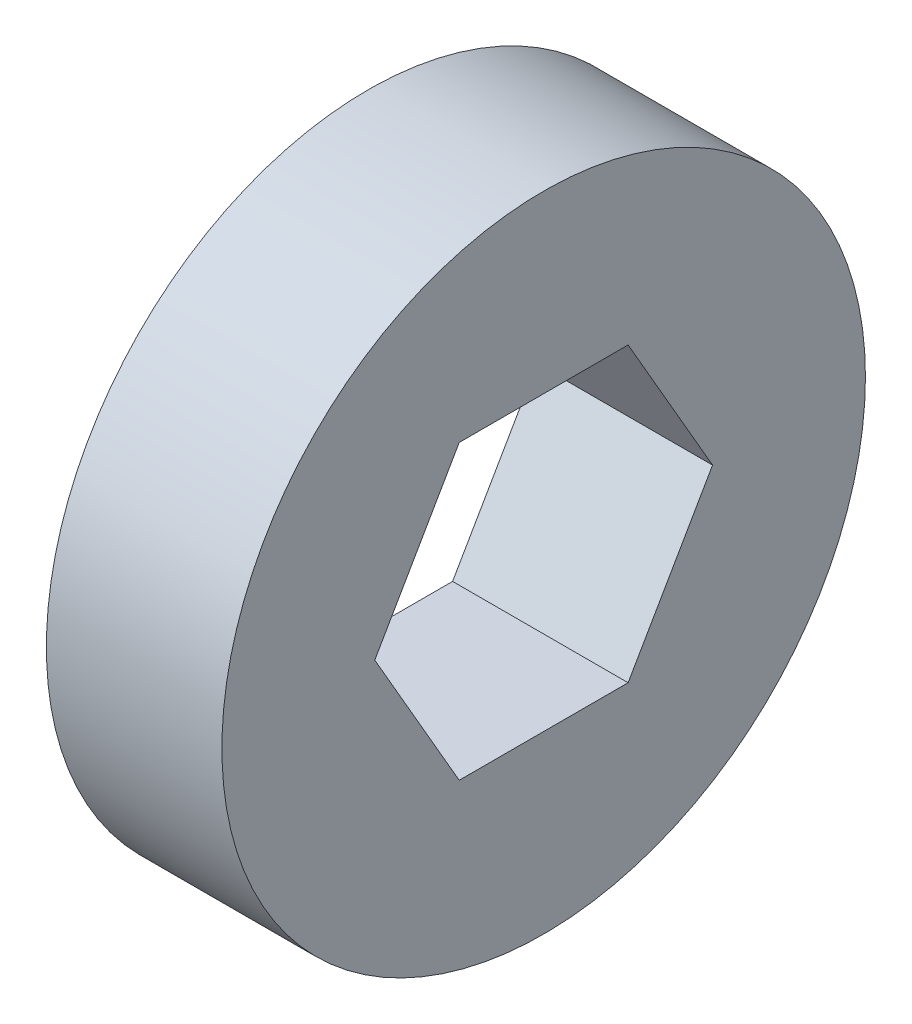
ISO-10303-21;
HEADER;
FILE_DESCRIPTION(('STEP AP214'),'2;1');
FILE_NAME('part.step','',(''),(''),'','','');
FILE_SCHEMA(('AUTOMOTIVE_DESIGN { 1 0 10303 214 1 1 1 1 }'));
ENDSEC;
DATA;
#1=APPLICATION_CONTEXT('core data for automotive mechanical design processes');
#2=APPLICATION_PROTOCOL_DEFINITION('international standard','automotive_design',2000,#1);
#3=PRODUCT_CONTEXT('',#1,'mechanical');
#4=PRODUCT('Part','Part','',(#3));
#5=PRODUCT_RELATED_PRODUCT_CATEGORY('part','',(#4));
#6=PRODUCT_DEFINITION_FORMATION('','',#4);
#7=PRODUCT_DEFINITION_CONTEXT('part definition',#1,'design');
#8=PRODUCT_DEFINITION('design','',#6,#7);
#9=PRODUCT_DEFINITION_SHAPE('','',#8);
#10=(LENGTH_UNIT() NAMED_UNIT(*) SI_UNIT(.MILLI.,.METRE.));
#11=(NAMED_UNIT(*) PLANE_ANGLE_UNIT() SI_UNIT($,.RADIAN.));
#12=(NAMED_UNIT(*) SI_UNIT($,.STERADIAN.) SOLID_ANGLE_UNIT());
#13=UNCERTAINTY_MEASURE_WITH_UNIT(LENGTH_MEASURE(1.E-05),#10,'distance_accuracy_value','');
#14=(GEOMETRIC_REPRESENTATION_CONTEXT(3) GLOBAL_UNCERTAINTY_ASSIGNED_CONTEXT((#13)) GLOBAL_UNIT_ASSIGNED_CONTEXT((#10,
#11,#12)) REPRESENTATION_CONTEXT('',''));
#15=CARTESIAN_POINT('',(0.,0.,0.));
#16=DIRECTION('',(0.,0.,1.));
#17=DIRECTION('',(1.,0.,0.));
#18=AXIS2_PLACEMENT_3D('',#15,#16,#17);
#19=CARTESIAN_POINT('',(3.,0.,0.));
#20=DIRECTION('',(1.,0.,0.));
#21=DIRECTION('',(0.,0.,-1.));
#22=AXIS2_PLACEMENT_3D('',#19,#20,#21);
#23=PLANE('',#22);
#24=CARTESIAN_POINT('',(3.,0.,0.));
#25=DIRECTION('',(1.,0.,0.));
#26=DIRECTION('',(0.,0.,-1.));
#27=AXIS2_PLACEMENT_3D('',#24,#25,#26);
#28=CIRCLE('',#27,5.5);
#29=CARTESIAN_POINT('',(3.,0.,-5.5));
#30=VERTEX_POINT('',#29);
#31=EDGE_CURVE('E11',#30,#30,#28,.T.);
#32=ORIENTED_EDGE('',*,*,#31,.T.);
#33=EDGE_LOOP('',(#32));
#34=FACE_BOUND('',#33,.T.);
#35=DIRECTION('',(0.,0.866025403784438,0.500000000000001));
#36=VECTOR('',#35,1.);
#37=CARTESIAN_POINT('',(3.,0.,-2.88675134594811));
#38=LINE('',#37,#36);
#39=CARTESIAN_POINT('',(3.,0.,-2.88675134594811));
#40=VERTEX_POINT('',#39);
#41=CARTESIAN_POINT('',(3.,2.49999999999999,-1.44337567297405));
#42=VERTEX_POINT('',#41);
#43=EDGE_CURVE('E104',#40,#42,#38,.T.);
#44=ORIENTED_EDGE('',*,*,#43,.F.);
#45=DIRECTION('',(0.,0.866025403784441,-0.499999999999995));
#46=VECTOR('',#45,1.);
#47=CARTESIAN_POINT('',(3.,-2.49999999999997,-1.44337567297409));
#48=LINE('',#47,#46);
#49=CARTESIAN_POINT('',(3.,-2.49999999999997,-1.44337567297409));
#50=VERTEX_POINT('',#49);
#51=EDGE_CURVE('E96',#50,#40,#48,.T.);
#52=ORIENTED_EDGE('',*,*,#51,.F.);
#53=DIRECTION('',(0.,0.,-1.));
#54=VECTOR('',#53,1.);
#55=CARTESIAN_POINT('',(3.,-2.5,1.44337567297403));
#56=LINE('',#55,#54);
#57=CARTESIAN_POINT('',(3.,-2.5,1.44337567297403));
#58=VERTEX_POINT('',#57);
#59=EDGE_CURVE('E124',#58,#50,#56,.T.);
#60=ORIENTED_EDGE('',*,*,#59,.F.);
#61=DIRECTION('',(0.,-0.866025403784435,-0.500000000000007));
#62=VECTOR('',#61,1.);
#63=CARTESIAN_POINT('',(3.,0.,2.88675134594811));
#64=LINE('',#63,#62);
#65=CARTESIAN_POINT('',(3.,0.,2.88675134594811));
#66=VERTEX_POINT('',#65);
#67=EDGE_CURVE('E122',#66,#58,#64,.T.);
#68=ORIENTED_EDGE('',*,*,#67,.F.);
#69=DIRECTION('',(0.,-0.866025403784441,0.499999999999995));
#70=VECTOR('',#69,1.);
#71=CARTESIAN_POINT('',(3.,2.49999999999998,1.44337567297407));
#72=LINE('',#71,#70);
#73=CARTESIAN_POINT('',(3.,2.49999999999998,1.44337567297407));
#74=VERTEX_POINT('',#73);
#75=EDGE_CURVE('E118',#74,#66,#72,.T.);
#76=ORIENTED_EDGE('',*,*,#75,.F.);
#77=DIRECTION('',(0.,0.,1.));
#78=VECTOR('',#77,1.);
#79=CARTESIAN_POINT('',(3.,2.49999999999999,-1.44337567297405));
#80=LINE('',#79,#78);
#81=EDGE_CURVE('E116',#42,#74,#80,.T.);
#82=ORIENTED_EDGE('',*,*,#81,.F.);
#83=EDGE_LOOP('',(#44,#52,#60,#68,#76,#82));
#84=FACE_BOUND('',#83,.T.);
#85=ADVANCED_FACE('F43',(#34,#84),#23,.T.);
#86=CARTESIAN_POINT('',(0.,0.,0.));
#87=DIRECTION('',(1.,0.,0.));
#88=DIRECTION('',(0.,0.,-1.));
#89=AXIS2_PLACEMENT_3D('',#86,#87,#88);
#90=PLANE('',#89);
#91=CARTESIAN_POINT('',(0.,0.,0.));
#92=DIRECTION('',(1.,0.,0.));
#93=DIRECTION('',(0.,0.,-1.));
#94=AXIS2_PLACEMENT_3D('',#91,#92,#93);
#95=CIRCLE('',#94,5.5);
#96=CARTESIAN_POINT('',(0.,0.,-5.5));
#97=VERTEX_POINT('',#96);
#98=EDGE_CURVE('E47',#97,#97,#95,.T.);
#99=ORIENTED_EDGE('',*,*,#98,.F.);
#100=EDGE_LOOP('',(#99));
#101=FACE_BOUND('',#100,.T.);
#102=DIRECTION('',(0.,0.866025403784441,-0.499999999999995));
#103=VECTOR('',#102,1.);
#104=CARTESIAN_POINT('',(0.,-2.49999999999997,-1.44337567297409));
#105=LINE('',#104,#103);
#106=CARTESIAN_POINT('',(0.,-2.49999999999997,-1.44337567297409));
#107=VERTEX_POINT('',#106);
#108=CARTESIAN_POINT('',(0.,0.,-2.88675134594811));
#109=VERTEX_POINT('',#108);
#110=EDGE_CURVE('E66',#107,#109,#105,.T.);
#111=ORIENTED_EDGE('',*,*,#110,.T.);
#112=DIRECTION('',(0.,0.866025403784438,0.500000000000001));
#113=VECTOR('',#112,1.);
#114=CARTESIAN_POINT('',(0.,0.,-2.88675134594811));
#115=LINE('',#114,#113);
#116=CARTESIAN_POINT('',(0.,2.49999999999999,-1.44337567297405));
#117=VERTEX_POINT('',#116);
#118=EDGE_CURVE('E111',#109,#117,#115,.T.);
#119=ORIENTED_EDGE('',*,*,#118,.T.);
#120=DIRECTION('',(0.,0.,1.));
#121=VECTOR('',#120,1.);
#122=CARTESIAN_POINT('',(0.,2.49999999999999,-1.44337567297405));
#123=LINE('',#122,#121);
#124=CARTESIAN_POINT('',(0.,2.49999999999998,1.44337567297407));
#125=VERTEX_POINT('',#124);
#126=EDGE_CURVE('E128',#117,#125,#123,.T.);
#127=ORIENTED_EDGE('',*,*,#126,.T.);
#128=DIRECTION('',(0.,-0.866025403784441,0.499999999999995));
#129=VECTOR('',#128,1.);
#130=CARTESIAN_POINT('',(0.,2.49999999999998,1.44337567297407));
#131=LINE('',#130,#129);
#132=CARTESIAN_POINT('',(0.,0.,2.88675134594811));
#133=VERTEX_POINT('',#132);
#134=EDGE_CURVE('E131',#125,#133,#131,.T.);
#135=ORIENTED_EDGE('',*,*,#134,.T.);
#136=DIRECTION('',(0.,-0.866025403784435,-0.500000000000007));
#137=VECTOR('',#136,1.);
#138=CARTESIAN_POINT('',(0.,0.,2.88675134594811));
#139=LINE('',#138,#137);
#140=CARTESIAN_POINT('',(0.,-2.5,1.44337567297403));
#141=VERTEX_POINT('',#140);
#142=EDGE_CURVE('E134',#133,#141,#139,.T.);
#143=ORIENTED_EDGE('',*,*,#142,.T.);
#144=DIRECTION('',(0.,0.,-1.));
#145=VECTOR('',#144,1.);
#146=CARTESIAN_POINT('',(0.,-2.5,1.44337567297403));
#147=LINE('',#146,#145);
#148=EDGE_CURVE('E105',#141,#107,#147,.T.);
#149=ORIENTED_EDGE('',*,*,#148,.T.);
#150=EDGE_LOOP('',(#111,#119,#127,#135,#143,#149));
#151=FACE_BOUND('',#150,.T.);
#152=ADVANCED_FACE('F151',(#101,#151),#90,.F.);
#153=CARTESIAN_POINT('',(3.,0.,0.));
#154=DIRECTION('',(-1.,0.,0.));
#155=DIRECTION('',(0.,0.,1.));
#156=AXIS2_PLACEMENT_3D('',#153,#154,#155);
#157=CYLINDRICAL_SURFACE('',#156,5.5);
#158=ORIENTED_EDGE('',*,*,#31,.F.);
#159=EDGE_LOOP('',(#158));
#160=FACE_BOUND('',#159,.T.);
#161=ORIENTED_EDGE('',*,*,#98,.T.);
#162=EDGE_LOOP('',(#161));
#163=FACE_BOUND('',#162,.T.);
#164=ADVANCED_FACE('F45',(#160,#163),#157,.T.);
#165=CARTESIAN_POINT('',(3.,-2.49999999999997,-1.44337567297409));
#166=DIRECTION('',(0.,0.499999999999995,0.866025403784442));
#167=DIRECTION('',(0.,-0.866025403784442,0.499999999999995));
#168=AXIS2_PLACEMENT_3D('',#165,#166,#167);
#169=PLANE('',#168);
#170=ORIENTED_EDGE('',*,*,#110,.F.);
#171=DIRECTION('',(-1.,0.,0.));
#172=VECTOR('',#171,1.);
#173=CARTESIAN_POINT('',(3.,-2.49999999999997,-1.44337567297409));
#174=LINE('',#173,#172);
#175=EDGE_CURVE('E100',#50,#107,#174,.T.);
#176=ORIENTED_EDGE('',*,*,#175,.F.);
#177=ORIENTED_EDGE('',*,*,#51,.T.);
#178=DIRECTION('',(-1.,0.,0.));
#179=VECTOR('',#178,1.);
#180=CARTESIAN_POINT('',(3.,0.,-2.88675134594811));
#181=LINE('',#180,#179);
#182=EDGE_CURVE('E99',#40,#109,#181,.T.);
#183=ORIENTED_EDGE('',*,*,#182,.T.);
#184=EDGE_LOOP('',(#170,#176,#177,#183));
#185=FACE_BOUND('',#184,.T.);
#186=ADVANCED_FACE('F98',(#185),#169,.T.);
#187=CARTESIAN_POINT('',(3.,0.,-2.88675134594811));
#188=DIRECTION('',(0.,-0.500000000000001,0.866025403784438));
#189=DIRECTION('',(0.,-0.866025403784438,-0.500000000000001));
#190=AXIS2_PLACEMENT_3D('',#187,#188,#189);
#191=PLANE('',#190);
#192=ORIENTED_EDGE('',*,*,#118,.F.);
#193=ORIENTED_EDGE('',*,*,#182,.F.);
#194=ORIENTED_EDGE('',*,*,#43,.T.);
#195=DIRECTION('',(-1.,0.,0.));
#196=VECTOR('',#195,1.);
#197=CARTESIAN_POINT('',(3.,2.49999999999999,-1.44337567297405));
#198=LINE('',#197,#196);
#199=EDGE_CURVE('E112',#42,#117,#198,.T.);
#200=ORIENTED_EDGE('',*,*,#199,.T.);
#201=EDGE_LOOP('',(#192,#193,#194,#200));
#202=FACE_BOUND('',#201,.T.);
#203=ADVANCED_FACE('F108',(#202),#191,.T.);
#204=CARTESIAN_POINT('',(3.,2.49999999999999,-1.44337567297405));
#205=DIRECTION('',(0.,-1.,0.));
#206=DIRECTION('',(0.,0.,-1.));
#207=AXIS2_PLACEMENT_3D('',#204,#205,#206);
#208=PLANE('',#207);
#209=ORIENTED_EDGE('',*,*,#126,.F.);
#210=ORIENTED_EDGE('',*,*,#199,.F.);
#211=ORIENTED_EDGE('',*,*,#81,.T.);
#212=DIRECTION('',(-1.,0.,0.));
#213=VECTOR('',#212,1.);
#214=CARTESIAN_POINT('',(3.,2.49999999999998,1.44337567297407));
#215=LINE('',#214,#213);
#216=EDGE_CURVE('E143',#74,#125,#215,.T.);
#217=ORIENTED_EDGE('',*,*,#216,.T.);
#218=EDGE_LOOP('',(#209,#210,#211,#217));
#219=FACE_BOUND('',#218,.T.);
#220=ADVANCED_FACE('F147',(#219),#208,.T.);
#221=CARTESIAN_POINT('',(3.,2.49999999999998,1.44337567297407));
#222=DIRECTION('',(0.,-0.499999999999995,-0.866025403784441));
#223=DIRECTION('',(0.,0.866025403784441,-0.499999999999995));
#224=AXIS2_PLACEMENT_3D('',#221,#222,#223);
#225=PLANE('',#224);
#226=ORIENTED_EDGE('',*,*,#134,.F.);
#227=ORIENTED_EDGE('',*,*,#216,.F.);
#228=ORIENTED_EDGE('',*,*,#75,.T.);
#229=DIRECTION('',(-1.,0.,0.));
#230=VECTOR('',#229,1.);
#231=CARTESIAN_POINT('',(3.,0.,2.88675134594811));
#232=LINE('',#231,#230);
#233=EDGE_CURVE('E141',#66,#133,#232,.T.);
#234=ORIENTED_EDGE('',*,*,#233,.T.);
#235=EDGE_LOOP('',(#226,#227,#228,#234));
#236=FACE_BOUND('',#235,.T.);
#237=ADVANCED_FACE('F159',(#236),#225,.T.);
#238=CARTESIAN_POINT('',(3.,0.,2.88675134594811));
#239=DIRECTION('',(0.,0.500000000000007,-0.866025403784434));
#240=DIRECTION('',(0.,0.866025403784435,0.500000000000007));
#241=AXIS2_PLACEMENT_3D('',#238,#239,#240);
#242=PLANE('',#241);
#243=ORIENTED_EDGE('',*,*,#142,.F.);
#244=ORIENTED_EDGE('',*,*,#233,.F.);
#245=ORIENTED_EDGE('',*,*,#67,.T.);
#246=DIRECTION('',(-1.,0.,0.));
#247=VECTOR('',#246,1.);
#248=CARTESIAN_POINT('',(3.,-2.5,1.44337567297403));
#249=LINE('',#248,#247);
#250=EDGE_CURVE('E58',#58,#141,#249,.T.);
#251=ORIENTED_EDGE('',*,*,#250,.T.);
#252=EDGE_LOOP('',(#243,#244,#245,#251));
#253=FACE_BOUND('',#252,.T.);
#254=ADVANCED_FACE('F157',(#253),#242,.T.);
#255=CARTESIAN_POINT('',(3.,-2.5,1.44337567297403));
#256=DIRECTION('',(0.,1.,0.));
#257=DIRECTION('',(0.,0.,1.));
#258=AXIS2_PLACEMENT_3D('',#255,#256,#257);
#259=PLANE('',#258);
#260=ORIENTED_EDGE('',*,*,#148,.F.);
#261=ORIENTED_EDGE('',*,*,#250,.F.);
#262=ORIENTED_EDGE('',*,*,#59,.T.);
#263=ORIENTED_EDGE('',*,*,#175,.T.);
#264=EDGE_LOOP('',(#260,#261,#262,#263));
#265=FACE_BOUND('',#264,.T.);
#266=ADVANCED_FACE('F153',(#265),#259,.T.);
#267=CLOSED_SHELL('',(#85,#152,#164,#186,#203,#220,#237,#254,#266));
#268=MANIFOLD_SOLID_BREP('B2',#267);
#269=ADVANCED_BREP_SHAPE_REPRESENTATION('',(#18,#268),#14);
#270=SHAPE_DEFINITION_REPRESENTATION(#9,#269);
ENDSEC;
END-ISO-10303-21;
